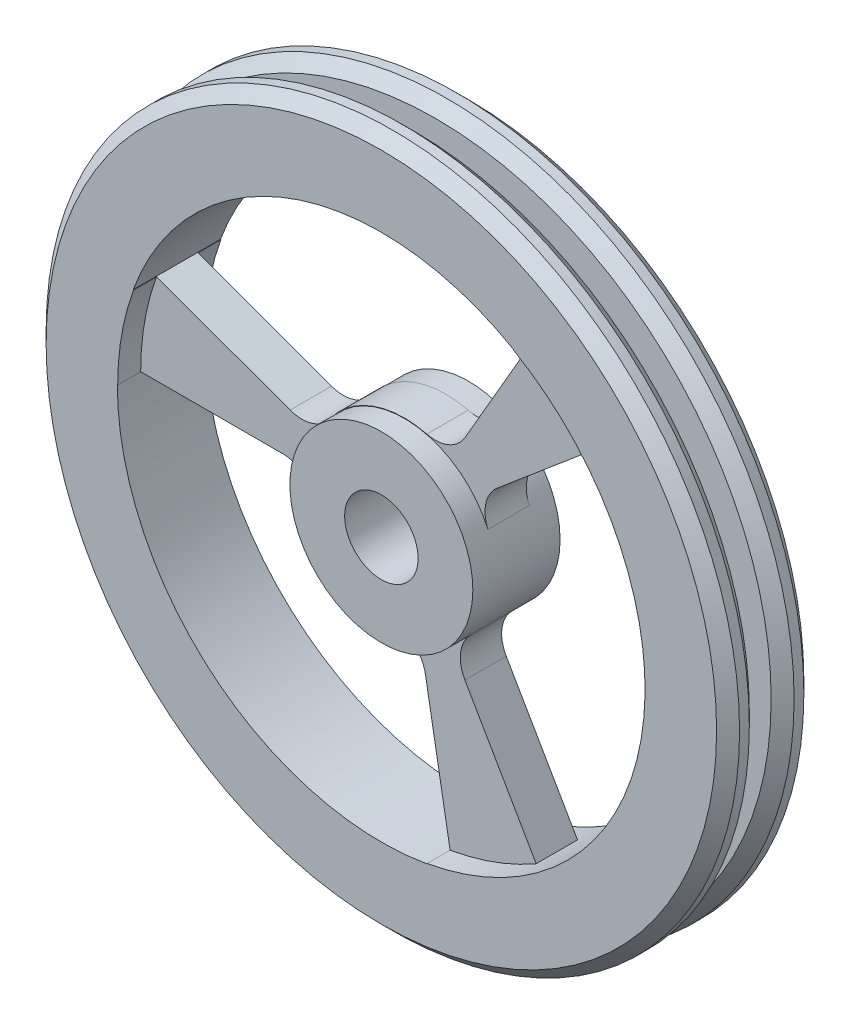
ISO-10303-21;
HEADER;
FILE_DESCRIPTION(('STEP AP214'),'2;1');
FILE_NAME('part.step','',(''),(''),'','','');
FILE_SCHEMA(('AUTOMOTIVE_DESIGN { 1 0 10303 214 1 1 1 1 }'));
ENDSEC;
DATA;
#1=APPLICATION_CONTEXT('core data for automotive mechanical design processes');
#2=APPLICATION_PROTOCOL_DEFINITION('international standard','automotive_design',2000,#1);
#3=PRODUCT_CONTEXT('',#1,'mechanical');
#4=PRODUCT('Part','Part','',(#3));
#5=PRODUCT_RELATED_PRODUCT_CATEGORY('part','',(#4));
#6=PRODUCT_DEFINITION_FORMATION('','',#4);
#7=PRODUCT_DEFINITION_CONTEXT('part definition',#1,'design');
#8=PRODUCT_DEFINITION('design','',#6,#7);
#9=PRODUCT_DEFINITION_SHAPE('','',#8);
#10=(LENGTH_UNIT() NAMED_UNIT(*) SI_UNIT(.MILLI.,.METRE.));
#11=(NAMED_UNIT(*) PLANE_ANGLE_UNIT() SI_UNIT($,.RADIAN.));
#12=(NAMED_UNIT(*) SI_UNIT($,.STERADIAN.) SOLID_ANGLE_UNIT());
#13=UNCERTAINTY_MEASURE_WITH_UNIT(LENGTH_MEASURE(1.E-05),#10,'distance_accuracy_value','');
#14=(GEOMETRIC_REPRESENTATION_CONTEXT(3) GLOBAL_UNCERTAINTY_ASSIGNED_CONTEXT((#13)) GLOBAL_UNIT_ASSIGNED_CONTEXT((#10,
#11,#12)) REPRESENTATION_CONTEXT('',''));
#15=CARTESIAN_POINT('',(0.,0.,0.));
#16=DIRECTION('',(0.,0.,1.));
#17=DIRECTION('',(1.,0.,0.));
#18=AXIS2_PLACEMENT_3D('',#15,#16,#17);
#19=CARTESIAN_POINT('',(0.,0.,19.304));
#20=DIRECTION('',(0.,0.,-1.));
#21=DIRECTION('',(-1.,0.,0.));
#22=AXIS2_PLACEMENT_3D('',#19,#20,#21);
#23=CYLINDRICAL_SURFACE('',#22,20.32);
#24=CARTESIAN_POINT('',(0.,0.,14.224));
#25=DIRECTION('',(0.,0.,1.));
#26=DIRECTION('',(1.,0.,0.));
#27=AXIS2_PLACEMENT_3D('',#24,#25,#26);
#28=CIRCLE('',#27,20.32);
#29=CARTESIAN_POINT('',(-19.5496969603027,-5.54181818181818,14.224));
#30=VERTEX_POINT('',#29);
#31=CARTESIAN_POINT('',(-2.06285626014119,-20.2150197637795,14.224));
#32=VERTEX_POINT('',#31);
#33=EDGE_CURVE('E561',#30,#32,#28,.T.);
#34=ORIENTED_EDGE('',*,*,#33,.F.);
#35=DIRECTION('',(0.,0.,-1.));
#36=VECTOR('',#35,1.);
#37=CARTESIAN_POINT('',(-19.5496969603027,-5.54181818181818,19.304));
#38=LINE('',#37,#36);
#39=CARTESIAN_POINT('',(-19.5496969603027,-5.54181818181818,5.08));
#40=VERTEX_POINT('',#39);
#41=EDGE_CURVE('E370',#30,#40,#38,.T.);
#42=ORIENTED_EDGE('',*,*,#41,.T.);
#43=CARTESIAN_POINT('',(0.,0.,5.08));
#44=DIRECTION('',(0.,0.,-1.));
#45=DIRECTION('',(-1.,0.,0.));
#46=AXIS2_PLACEMENT_3D('',#43,#44,#45);
#47=CIRCLE('',#46,20.32);
#48=CARTESIAN_POINT('',(-2.06285626014119,-20.2150197637795,5.08));
#49=VERTEX_POINT('',#48);
#50=EDGE_CURVE('E469',#49,#40,#47,.T.);
#51=ORIENTED_EDGE('',*,*,#50,.F.);
#52=DIRECTION('',(0.,0.,-1.));
#53=VECTOR('',#52,1.);
#54=CARTESIAN_POINT('',(-2.06285626014119,-20.2150197637795,19.304));
#55=LINE('',#54,#53);
#56=EDGE_CURVE('E364',#49,#32,#55,.F.);
#57=ORIENTED_EDGE('',*,*,#56,.T.);
#58=EDGE_LOOP('',(#34,#42,#51,#57));
#59=FACE_BOUND('',#58,.T.);
#60=ADVANCED_FACE('F50',(#59),#23,.T.);
#61=CARTESIAN_POINT('',(15.5725914999473,12.9212893123702,19.304));
#62=DIRECTION('',(-0.645028410307305,0.764158589493327,0.));
#63=DIRECTION('',(-0.764158589493327,-0.645028410307305,0.));
#64=AXIS2_PLACEMENT_3D('',#61,#62,#63);
#65=PLANE('',#64);
#66=DIRECTION('',(0.764158589493327,0.645028410307305,0.));
#67=VECTOR('',#66,1.);
#68=CARTESIAN_POINT('',(15.5725914999473,12.9212893123702,14.224));
#69=LINE('',#68,#67);
#70=CARTESIAN_POINT('',(20.5465180910194,17.1197947092038,14.224));
#71=VERTEX_POINT('',#70);
#72=CARTESIAN_POINT('',(44.6873937399769,37.4971756054888,14.224));
#73=VERTEX_POINT('',#72);
#74=EDGE_CURVE('E575',#71,#73,#69,.T.);
#75=ORIENTED_EDGE('',*,*,#74,.F.);
#76=DIRECTION('',(0.,0.,1.));
#77=VECTOR('',#76,1.);
#78=CARTESIAN_POINT('',(20.5465180910194,17.1197947092038,5.08));
#79=LINE('',#78,#77);
#80=CARTESIAN_POINT('',(20.5465180910194,17.1197947092038,5.08));
#81=VERTEX_POINT('',#80);
#82=EDGE_CURVE('E389',#71,#81,#79,.F.);
#83=ORIENTED_EDGE('',*,*,#82,.T.);
#84=DIRECTION('',(-0.764158589493327,-0.645028410307305,0.));
#85=VECTOR('',#84,1.);
#86=CARTESIAN_POINT('',(15.5725914999473,12.9212893123702,5.08));
#87=LINE('',#86,#85);
#88=CARTESIAN_POINT('',(44.6873937399769,37.4971756054888,5.08));
#89=VERTEX_POINT('',#88);
#90=EDGE_CURVE('E431',#89,#81,#87,.T.);
#91=ORIENTED_EDGE('',*,*,#90,.F.);
#92=DIRECTION('',(0.,0.,-1.));
#93=VECTOR('',#92,1.);
#94=CARTESIAN_POINT('',(44.6873937399769,37.4971756054888,19.304));
#95=LINE('',#94,#93);
#96=EDGE_CURVE('E486',#73,#89,#95,.T.);
#97=ORIENTED_EDGE('',*,*,#96,.F.);
#98=EDGE_LOOP('',(#75,#83,#91,#97));
#99=FACE_BOUND('',#98,.T.);
#100=ADVANCED_FACE('F630',(#99),#65,.F.);
#101=CARTESIAN_POINT('',(29.167624764714,-50.5198080285885,19.304));
#102=DIRECTION('',(-0.866025403784437,-0.500000000000003,0.));
#103=DIRECTION('',(0.500000000000003,-0.866025403784437,0.));
#104=AXIS2_PLACEMENT_3D('',#101,#102,#103);
#105=PLANE('',#104);
#106=DIRECTION('',(0.500000000000003,-0.866025403784437,0.));
#107=VECTOR('',#106,1.);
#108=CARTESIAN_POINT('',(29.167624764714,-50.5198080285885,5.08));
#109=LINE('',#108,#107);
#110=CARTESIAN_POINT('',(13.3963663575864,-23.2031871681458,5.08));
#111=VERTEX_POINT('',#110);
#112=CARTESIAN_POINT('',(29.167624764714,-50.5198080285885,5.08));
#113=VERTEX_POINT('',#112);
#114=EDGE_CURVE('E461',#111,#113,#109,.T.);
#115=ORIENTED_EDGE('',*,*,#114,.F.);
#116=DIRECTION('',(0.,0.,1.));
#117=VECTOR('',#116,1.);
#118=CARTESIAN_POINT('',(13.3963663575864,-23.2031871681458,14.224));
#119=LINE('',#118,#117);
#120=CARTESIAN_POINT('',(13.3963663575864,-23.2031871681458,14.224));
#121=VERTEX_POINT('',#120);
#122=EDGE_CURVE('E388',#111,#121,#119,.T.);
#123=ORIENTED_EDGE('',*,*,#122,.T.);
#124=DIRECTION('',(-0.500000000000003,0.866025403784437,0.));
#125=VECTOR('',#124,1.);
#126=CARTESIAN_POINT('',(29.167624764714,-50.5198080285885,14.224));
#127=LINE('',#126,#125);
#128=CARTESIAN_POINT('',(29.167624764714,-50.5198080285885,14.224));
#129=VERTEX_POINT('',#128);
#130=EDGE_CURVE('E568',#129,#121,#127,.T.);
#131=ORIENTED_EDGE('',*,*,#130,.F.);
#132=DIRECTION('',(0.,0.,-1.));
#133=VECTOR('',#132,1.);
#134=CARTESIAN_POINT('',(29.167624764714,-50.5198080285885,19.304));
#135=LINE('',#134,#133);
#136=EDGE_CURVE('E490',#129,#113,#135,.T.);
#137=ORIENTED_EDGE('',*,*,#136,.T.);
#138=EDGE_LOOP('',(#115,#123,#131,#137));
#139=FACE_BOUND('',#138,.T.);
#140=ADVANCED_FACE('F627',(#139),#105,.F.);
#141=CARTESIAN_POINT('',(0.,0.,19.304));
#142=DIRECTION('',(0.,0.,-1.));
#143=DIRECTION('',(-1.,0.,0.));
#144=AXIS2_PLACEMENT_3D('',#141,#142,#143);
#145=CYLINDRICAL_SURFACE('',#144,20.32);
#146=CARTESIAN_POINT('',(0.,0.,14.224));
#147=DIRECTION('',(0.,0.,1.));
#148=DIRECTION('',(1.,0.,0.));
#149=AXIS2_PLACEMENT_3D('',#146,#147,#148);
#150=CIRCLE('',#149,20.32);
#151=CARTESIAN_POINT('',(4.97549315154242,19.7014432948186,14.224));
#152=VERTEX_POINT('',#151);
#153=CARTESIAN_POINT('',(-16.4752925233669,11.8939958075278,14.224));
#154=VERTEX_POINT('',#153);
#155=EDGE_CURVE('E536',#152,#154,#150,.T.);
#156=ORIENTED_EDGE('',*,*,#155,.F.);
#157=DIRECTION('',(0.,0.,-1.));
#158=VECTOR('',#157,1.);
#159=CARTESIAN_POINT('',(4.97549315154242,19.7014432948186,19.304));
#160=LINE('',#159,#158);
#161=CARTESIAN_POINT('',(4.97549315154242,19.7014432948186,5.08));
#162=VERTEX_POINT('',#161);
#163=EDGE_CURVE('E355',#152,#162,#160,.T.);
#164=ORIENTED_EDGE('',*,*,#163,.T.);
#165=CARTESIAN_POINT('',(0.,0.,5.08));
#166=DIRECTION('',(0.,0.,-1.));
#167=DIRECTION('',(-1.,0.,0.));
#168=AXIS2_PLACEMENT_3D('',#165,#166,#167);
#169=CIRCLE('',#168,20.32);
#170=CARTESIAN_POINT('',(-16.4752925233669,11.8939958075278,5.08));
#171=VERTEX_POINT('',#170);
#172=EDGE_CURVE('E453',#171,#162,#169,.T.);
#173=ORIENTED_EDGE('',*,*,#172,.F.);
#174=DIRECTION('',(0.,0.,-1.));
#175=VECTOR('',#174,1.);
#176=CARTESIAN_POINT('',(-16.4752925233669,11.8939958075278,19.304));
#177=LINE('',#176,#175);
#178=EDGE_CURVE('E250',#171,#154,#177,.F.);
#179=ORIENTED_EDGE('',*,*,#178,.T.);
#180=EDGE_LOOP('',(#156,#164,#173,#179));
#181=FACE_BOUND('',#180,.T.);
#182=ADVANCED_FACE('F544',(#181),#145,.T.);
#183=CARTESIAN_POINT('',(0.,8.128,19.304));
#184=DIRECTION('',(0.,0.,1.));
#185=DIRECTION('',(1.,0.,0.));
#186=AXIS2_PLACEMENT_3D('',#183,#184,#185);
#187=PLANE('',#186);
#188=CARTESIAN_POINT('',(0.,0.,19.304));
#189=DIRECTION('',(0.,0.,-1.));
#190=DIRECTION('',(-1.,0.,0.));
#191=AXIS2_PLACEMENT_3D('',#188,#189,#190);
#192=CIRCLE('',#191,8.128);
#193=CARTESIAN_POINT('',(-8.128,0.,19.304));
#194=VERTEX_POINT('',#193);
#195=EDGE_CURVE('E305',#194,#194,#192,.T.);
#196=ORIENTED_EDGE('',*,*,#195,.T.);
#197=EDGE_LOOP('',(#196));
#198=FACE_BOUND('',#197,.T.);
#199=CARTESIAN_POINT('',(0.,0.,19.304));
#200=DIRECTION('',(0.,0.,1.));
#201=DIRECTION('',(1.,0.,0.));
#202=AXIS2_PLACEMENT_3D('',#199,#200,#201);
#203=CIRCLE('',#202,20.2352495294277);
#204=CARTESIAN_POINT('',(20.2352495294277,0.,19.304));
#205=VERTEX_POINT('',#204);
#206=EDGE_CURVE('E232',#205,#205,#203,.T.);
#207=ORIENTED_EDGE('',*,*,#206,.T.);
#208=EDGE_LOOP('',(#207));
#209=FACE_BOUND('',#208,.T.);
#210=ADVANCED_FACE('F648',(#198,#209),#187,.T.);
#211=CARTESIAN_POINT('',(0.,76.708,0.));
#212=DIRECTION('',(0.,0.,-1.));
#213=DIRECTION('',(-1.,0.,0.));
#214=AXIS2_PLACEMENT_3D('',#211,#212,#213);
#215=PLANE('',#214);
#216=CARTESIAN_POINT('',(0.,0.,0.));
#217=DIRECTION('',(0.,0.,-1.));
#218=DIRECTION('',(-1.,0.,0.));
#219=AXIS2_PLACEMENT_3D('',#216,#217,#218);
#220=CIRCLE('',#219,8.128);
#221=CARTESIAN_POINT('',(-8.128,0.,0.));
#222=VERTEX_POINT('',#221);
#223=EDGE_CURVE('E306',#222,#222,#220,.T.);
#224=ORIENTED_EDGE('',*,*,#223,.F.);
#225=EDGE_LOOP('',(#224));
#226=FACE_BOUND('',#225,.T.);
#227=CARTESIAN_POINT('',(0.,0.,0.));
#228=DIRECTION('',(0.,0.,1.));
#229=DIRECTION('',(1.,0.,0.));
#230=AXIS2_PLACEMENT_3D('',#227,#228,#229);
#231=CIRCLE('',#230,20.2352495294277);
#232=CARTESIAN_POINT('',(20.2352495294277,0.,0.));
#233=VERTEX_POINT('',#232);
#234=EDGE_CURVE('E234',#233,#233,#231,.T.);
#235=ORIENTED_EDGE('',*,*,#234,.F.);
#236=EDGE_LOOP('',(#235));
#237=FACE_BOUND('',#236,.T.);
#238=ADVANCED_FACE('F684',(#226,#237),#215,.T.);
#239=CARTESIAN_POINT('',(0.,0.,0.));
#240=DIRECTION('',(0.,0.,-1.));
#241=DIRECTION('',(-1.,0.,0.));
#242=AXIS2_PLACEMENT_3D('',#239,#240,#241);
#243=CIRCLE('',#242,58.3352495294277);
#244=CARTESIAN_POINT('',(-58.3352495294277,0.,0.));
#245=VERTEX_POINT('',#244);
#246=CARTESIAN_POINT('',(-54.8172035145079,19.9518304049933,0.));
#247=VERTEX_POINT('',#246);
#248=EDGE_CURVE('E438',#245,#247,#243,.T.);
#249=ORIENTED_EDGE('',*,*,#248,.F.);
#250=DIRECTION('',(1.,0.,0.));
#251=VECTOR('',#250,1.);
#252=CARTESIAN_POINT('',(-58.42,0.,0.));
#253=LINE('',#252,#251);
#254=CARTESIAN_POINT('',(-58.42,0.,0.));
#255=VERTEX_POINT('',#254);
#256=EDGE_CURVE('E277',#255,#245,#253,.T.);
#257=ORIENTED_EDGE('',*,*,#256,.F.);
#258=CARTESIAN_POINT('',(0.,0.,0.));
#259=DIRECTION('',(0.,0.,-1.));
#260=DIRECTION('',(1.,0.,0.));
#261=AXIS2_PLACEMENT_3D('',#258,#259,#260);
#262=CIRCLE('',#261,58.42);
#263=CARTESIAN_POINT('',(10.1445265393023,-57.5324689309732,0.));
#264=VERTEX_POINT('',#263);
#265=EDGE_CURVE('E280',#264,#255,#262,.T.);
#266=ORIENTED_EDGE('',*,*,#265,.F.);
#267=DIRECTION('',(0.173648177666934,-0.984807753012207,0.));
#268=VECTOR('',#267,1.);
#269=CARTESIAN_POINT('',(10.1445265393023,-57.5324689309732,0.));
#270=LINE('',#269,#268);
#271=CARTESIAN_POINT('',(10.129809774531,-57.4490060104821,0.));
#272=VERTEX_POINT('',#271);
#273=EDGE_CURVE('E267',#272,#264,#270,.T.);
#274=ORIENTED_EDGE('',*,*,#273,.F.);
#275=CARTESIAN_POINT('',(0.,0.,0.));
#276=DIRECTION('',(0.,0.,-1.));
#277=DIRECTION('',(-1.,0.,0.));
#278=AXIS2_PLACEMENT_3D('',#275,#276,#277);
#279=CIRCLE('',#278,58.3352495294277);
#280=CARTESIAN_POINT('',(29.1676247647141,50.5198080285885,0.));
#281=VERTEX_POINT('',#280);
#282=EDGE_CURVE('E498',#281,#272,#279,.T.);
#283=ORIENTED_EDGE('',*,*,#282,.F.);
#284=DIRECTION('',(-0.500000000000004,-0.866025403784436,0.));
#285=VECTOR('',#284,1.);
#286=CARTESIAN_POINT('',(29.2100000000002,50.5932040890868,0.));
#287=LINE('',#286,#285);
#288=CARTESIAN_POINT('',(29.2100000000002,50.5932040890868,0.));
#289=VERTEX_POINT('',#288);
#290=EDGE_CURVE('E515',#289,#281,#287,.T.);
#291=ORIENTED_EDGE('',*,*,#290,.F.);
#292=CARTESIAN_POINT('',(0.,0.,0.));
#293=DIRECTION('',(0.,0.,-1.));
#294=DIRECTION('',(-1.,0.,0.));
#295=AXIS2_PLACEMENT_3D('',#292,#293,#294);
#296=CIRCLE('',#295,58.42);
#297=CARTESIAN_POINT('',(-54.8968429063128,19.9808167730854,0.));
#298=VERTEX_POINT('',#297);
#299=EDGE_CURVE('E284',#298,#289,#296,.T.);
#300=ORIENTED_EDGE('',*,*,#299,.F.);
#301=DIRECTION('',(-0.93969262078591,0.342020143325666,0.));
#302=VECTOR('',#301,1.);
#303=CARTESIAN_POINT('',(-54.8968429063128,19.9808167730854,0.));
#304=LINE('',#303,#302);
#305=EDGE_CURVE('E256',#247,#298,#304,.T.);
#306=ORIENTED_EDGE('',*,*,#305,.F.);
#307=EDGE_LOOP('',(#249,#257,#266,#274,#283,#291,#300,#306));
#308=FACE_BOUND('',#307,.T.);
#309=CARTESIAN_POINT('',(0.,0.,0.));
#310=DIRECTION('',(0.,0.,-1.));
#311=DIRECTION('',(-1.,0.,0.));
#312=AXIS2_PLACEMENT_3D('',#309,#310,#311);
#313=CIRCLE('',#312,74.168);
#314=CARTESIAN_POINT('',(-74.168,0.,0.));
#315=VERTEX_POINT('',#314);
#316=EDGE_CURVE('E309',#315,#315,#313,.T.);
#317=ORIENTED_EDGE('',*,*,#316,.T.);
#318=EDGE_LOOP('',(#317));
#319=FACE_BOUND('',#318,.T.);
#320=ADVANCED_FACE('F523',(#308,#319),#215,.T.);
#321=CARTESIAN_POINT('',(0.,0.,0.));
#322=DIRECTION('',(0.,0.,-1.));
#323=DIRECTION('',(-1.,0.,0.));
#324=AXIS2_PLACEMENT_3D('',#321,#322,#323);
#325=CYLINDRICAL_SURFACE('',#324,8.128);
#326=ORIENTED_EDGE('',*,*,#223,.T.);
#327=EDGE_LOOP('',(#326));
#328=FACE_BOUND('',#327,.T.);
#329=ORIENTED_EDGE('',*,*,#195,.F.);
#330=EDGE_LOOP('',(#329));
#331=FACE_BOUND('',#330,.T.);
#332=ADVANCED_FACE('F676',(#328,#331),#325,.F.);
#333=DIRECTION('',(-0.500000000000004,-0.866025403784436,0.));
#334=VECTOR('',#333,1.);
#335=CARTESIAN_POINT('',(29.2100000000002,50.5932040890868,19.304));
#336=LINE('',#335,#334);
#337=CARTESIAN_POINT('',(29.2100000000002,50.5932040890868,19.304));
#338=VERTEX_POINT('',#337);
#339=CARTESIAN_POINT('',(29.1676247647141,50.5198080285884,19.304));
#340=VERTEX_POINT('',#339);
#341=EDGE_CURVE('E245',#338,#340,#336,.T.);
#342=ORIENTED_EDGE('',*,*,#341,.T.);
#343=CARTESIAN_POINT('',(0.,0.,19.304));
#344=DIRECTION('',(0.,0.,-1.));
#345=DIRECTION('',(-1.,0.,0.));
#346=AXIS2_PLACEMENT_3D('',#343,#344,#345);
#347=CIRCLE('',#346,58.3352495294277);
#348=CARTESIAN_POINT('',(10.129809774531,-57.4490060104821,19.304));
#349=VERTEX_POINT('',#348);
#350=EDGE_CURVE('E217',#340,#349,#347,.T.);
#351=ORIENTED_EDGE('',*,*,#350,.T.);
#352=DIRECTION('',(0.173648177666934,-0.984807753012207,0.));
#353=VECTOR('',#352,1.);
#354=CARTESIAN_POINT('',(10.1445265393023,-57.5324689309732,19.304));
#355=LINE('',#354,#353);
#356=CARTESIAN_POINT('',(10.1445265393023,-57.5324689309732,19.304));
#357=VERTEX_POINT('',#356);
#358=EDGE_CURVE('E271',#349,#357,#355,.T.);
#359=ORIENTED_EDGE('',*,*,#358,.T.);
#360=CARTESIAN_POINT('',(0.,0.,19.304));
#361=DIRECTION('',(0.,0.,-1.));
#362=DIRECTION('',(1.,0.,0.));
#363=AXIS2_PLACEMENT_3D('',#360,#361,#362);
#364=CIRCLE('',#363,58.42);
#365=CARTESIAN_POINT('',(-58.42,0.,19.304));
#366=VERTEX_POINT('',#365);
#367=EDGE_CURVE('E263',#357,#366,#364,.T.);
#368=ORIENTED_EDGE('',*,*,#367,.T.);
#369=DIRECTION('',(1.,0.,0.));
#370=VECTOR('',#369,1.);
#371=CARTESIAN_POINT('',(-58.42,0.,19.304));
#372=LINE('',#371,#370);
#373=CARTESIAN_POINT('',(-58.3352495294277,0.,19.304));
#374=VERTEX_POINT('',#373);
#375=EDGE_CURVE('E268',#366,#374,#372,.T.);
#376=ORIENTED_EDGE('',*,*,#375,.T.);
#377=CARTESIAN_POINT('',(0.,0.,19.304));
#378=DIRECTION('',(0.,0.,1.));
#379=DIRECTION('',(1.,0.,0.));
#380=AXIS2_PLACEMENT_3D('',#377,#378,#379);
#381=CIRCLE('',#380,58.3352495294277);
#382=CARTESIAN_POINT('',(-54.8172035145079,19.9518304049933,19.304));
#383=VERTEX_POINT('',#382);
#384=EDGE_CURVE('E558',#383,#374,#381,.T.);
#385=ORIENTED_EDGE('',*,*,#384,.F.);
#386=DIRECTION('',(-0.93969262078591,0.342020143325666,0.));
#387=VECTOR('',#386,1.);
#388=CARTESIAN_POINT('',(-54.8968429063128,19.9808167730854,19.304));
#389=LINE('',#388,#387);
#390=CARTESIAN_POINT('',(-54.8968429063128,19.9808167730854,19.304));
#391=VERTEX_POINT('',#390);
#392=EDGE_CURVE('E251',#383,#391,#389,.T.);
#393=ORIENTED_EDGE('',*,*,#392,.T.);
#394=CARTESIAN_POINT('',(0.,0.,19.304));
#395=DIRECTION('',(0.,0.,-1.));
#396=DIRECTION('',(-1.,0.,0.));
#397=AXIS2_PLACEMENT_3D('',#394,#395,#396);
#398=CIRCLE('',#397,58.42);
#399=EDGE_CURVE('E255',#391,#338,#398,.T.);
#400=ORIENTED_EDGE('',*,*,#399,.T.);
#401=EDGE_LOOP('',(#342,#351,#359,#368,#376,#385,#393,#400));
#402=FACE_BOUND('',#401,.T.);
#403=CARTESIAN_POINT('',(0.,0.,19.304));
#404=DIRECTION('',(0.,0.,1.));
#405=DIRECTION('',(1.,0.,0.));
#406=AXIS2_PLACEMENT_3D('',#403,#404,#405);
#407=CIRCLE('',#406,74.168);
#408=CARTESIAN_POINT('',(74.168,0.,19.304));
#409=VERTEX_POINT('',#408);
#410=EDGE_CURVE('E332',#409,#409,#407,.T.);
#411=ORIENTED_EDGE('',*,*,#410,.T.);
#412=EDGE_LOOP('',(#411));
#413=FACE_BOUND('',#412,.T.);
#414=ADVANCED_FACE('F248',(#402,#413),#187,.T.);
#415=CARTESIAN_POINT('',(0.,0.,0.));
#416=DIRECTION('',(0.,0.,-1.));
#417=DIRECTION('',(-1.,0.,0.));
#418=AXIS2_PLACEMENT_3D('',#415,#416,#417);
#419=CYLINDRICAL_SURFACE('',#418,76.708);
#420=CARTESIAN_POINT('',(0.,0.,16.764));
#421=DIRECTION('',(0.,0.,1.));
#422=DIRECTION('',(1.,0.,0.));
#423=AXIS2_PLACEMENT_3D('',#420,#421,#422);
#424=CIRCLE('',#423,76.708);
#425=CARTESIAN_POINT('',(76.708,0.,16.764));
#426=VERTEX_POINT('',#425);
#427=EDGE_CURVE('E329',#426,#426,#424,.F.);
#428=ORIENTED_EDGE('',*,*,#427,.T.);
#429=EDGE_LOOP('',(#428));
#430=FACE_BOUND('',#429,.T.);
#431=CARTESIAN_POINT('',(0.,0.,14.605));
#432=DIRECTION('',(0.,0.,-1.));
#433=DIRECTION('',(-1.,0.,0.));
#434=AXIS2_PLACEMENT_3D('',#431,#432,#433);
#435=CIRCLE('',#434,76.708);
#436=CARTESIAN_POINT('',(-76.708,0.,14.605));
#437=VERTEX_POINT('',#436);
#438=EDGE_CURVE('E326',#437,#437,#435,.F.);
#439=ORIENTED_EDGE('',*,*,#438,.T.);
#440=EDGE_LOOP('',(#439));
#441=FACE_BOUND('',#440,.T.);
#442=ADVANCED_FACE('F671',(#430,#441),#419,.T.);
#443=CARTESIAN_POINT('',(0.,76.708,12.065));
#444=DIRECTION('',(0.,0.,-1.));
#445=DIRECTION('',(-1.,0.,0.));
#446=AXIS2_PLACEMENT_3D('',#443,#444,#445);
#447=PLANE('',#446);
#448=CARTESIAN_POINT('',(0.,0.,12.065));
#449=DIRECTION('',(0.,0.,-1.));
#450=DIRECTION('',(-1.,0.,0.));
#451=AXIS2_PLACEMENT_3D('',#448,#449,#450);
#452=CIRCLE('',#451,74.1679999999999);
#453=CARTESIAN_POINT('',(-74.1679999999999,0.,12.065));
#454=VERTEX_POINT('',#453);
#455=EDGE_CURVE('E336',#454,#454,#452,.T.);
#456=ORIENTED_EDGE('',*,*,#455,.T.);
#457=EDGE_LOOP('',(#456));
#458=FACE_BOUND('',#457,.T.);
#459=CARTESIAN_POINT('',(0.,0.,12.065));
#460=DIRECTION('',(0.,0.,-1.));
#461=DIRECTION('',(-1.,0.,0.));
#462=AXIS2_PLACEMENT_3D('',#459,#460,#461);
#463=CIRCLE('',#462,64.008);
#464=CARTESIAN_POINT('',(-64.008,0.,12.065));
#465=VERTEX_POINT('',#464);
#466=EDGE_CURVE('E296',#465,#465,#463,.T.);
#467=ORIENTED_EDGE('',*,*,#466,.F.);
#468=EDGE_LOOP('',(#467));
#469=FACE_BOUND('',#468,.T.);
#470=ADVANCED_FACE('F666',(#458,#469),#447,.T.);
#471=CARTESIAN_POINT('',(0.,0.,0.));
#472=DIRECTION('',(0.,0.,-1.));
#473=DIRECTION('',(-1.,0.,0.));
#474=AXIS2_PLACEMENT_3D('',#471,#472,#473);
#475=CYLINDRICAL_SURFACE('',#474,64.008);
#476=ORIENTED_EDGE('',*,*,#466,.T.);
#477=EDGE_LOOP('',(#476));
#478=FACE_BOUND('',#477,.T.);
#479=CARTESIAN_POINT('',(0.,0.,7.239));
#480=DIRECTION('',(0.,0.,-1.));
#481=DIRECTION('',(-1.,0.,0.));
#482=AXIS2_PLACEMENT_3D('',#479,#480,#481);
#483=CIRCLE('',#482,64.008);
#484=CARTESIAN_POINT('',(-64.008,0.,7.239));
#485=VERTEX_POINT('',#484);
#486=EDGE_CURVE('E293',#485,#485,#483,.T.);
#487=ORIENTED_EDGE('',*,*,#486,.F.);
#488=EDGE_LOOP('',(#487));
#489=FACE_BOUND('',#488,.T.);
#490=ADVANCED_FACE('F664',(#478,#489),#475,.T.);
#491=CARTESIAN_POINT('',(0.,64.008,7.239));
#492=DIRECTION('',(0.,0.,1.));
#493=DIRECTION('',(1.,0.,0.));
#494=AXIS2_PLACEMENT_3D('',#491,#492,#493);
#495=PLANE('',#494);
#496=CARTESIAN_POINT('',(0.,0.,7.239));
#497=DIRECTION('',(0.,0.,1.));
#498=DIRECTION('',(1.,0.,0.));
#499=AXIS2_PLACEMENT_3D('',#496,#497,#498);
#500=CIRCLE('',#499,74.168);
#501=CARTESIAN_POINT('',(74.168,0.,7.239));
#502=VERTEX_POINT('',#501);
#503=EDGE_CURVE('E325',#502,#502,#500,.T.);
#504=ORIENTED_EDGE('',*,*,#503,.T.);
#505=EDGE_LOOP('',(#504));
#506=FACE_BOUND('',#505,.T.);
#507=ORIENTED_EDGE('',*,*,#486,.T.);
#508=EDGE_LOOP('',(#507));
#509=FACE_BOUND('',#508,.T.);
#510=ADVANCED_FACE('F659',(#506,#509),#495,.T.);
#511=CARTESIAN_POINT('',(0.,0.,0.));
#512=DIRECTION('',(0.,0.,-1.));
#513=DIRECTION('',(-1.,0.,0.));
#514=AXIS2_PLACEMENT_3D('',#511,#512,#513);
#515=CYLINDRICAL_SURFACE('',#514,76.708);
#516=CARTESIAN_POINT('',(0.,0.,2.54000000000004));
#517=DIRECTION('',(0.,0.,-1.));
#518=DIRECTION('',(-1.,0.,0.));
#519=AXIS2_PLACEMENT_3D('',#516,#517,#518);
#520=CIRCLE('',#519,76.708);
#521=CARTESIAN_POINT('',(-76.708,0.,2.54000000000004));
#522=VERTEX_POINT('',#521);
#523=EDGE_CURVE('E319',#522,#522,#520,.F.);
#524=ORIENTED_EDGE('',*,*,#523,.T.);
#525=EDGE_LOOP('',(#524));
#526=FACE_BOUND('',#525,.T.);
#527=CARTESIAN_POINT('',(0.,0.,4.69900000000003));
#528=DIRECTION('',(0.,0.,1.));
#529=DIRECTION('',(1.,0.,0.));
#530=AXIS2_PLACEMENT_3D('',#527,#528,#529);
#531=CIRCLE('',#530,76.708);
#532=CARTESIAN_POINT('',(76.708,0.,4.69900000000003));
#533=VERTEX_POINT('',#532);
#534=EDGE_CURVE('E313',#533,#533,#531,.F.);
#535=ORIENTED_EDGE('',*,*,#534,.T.);
#536=EDGE_LOOP('',(#535));
#537=FACE_BOUND('',#536,.T.);
#538=ADVANCED_FACE('F656',(#526,#537),#515,.T.);
#539=CARTESIAN_POINT('',(0.,0.,0.));
#540=DIRECTION('',(0.,0.,1.));
#541=DIRECTION('',(1.,0.,0.));
#542=AXIS2_PLACEMENT_3D('',#539,#540,#541);
#543=CONICAL_SURFACE('',#542,74.168,0.785398163397443);
#544=ORIENTED_EDGE('',*,*,#523,.F.);
#545=EDGE_LOOP('',(#544));
#546=FACE_BOUND('',#545,.T.);
#547=ORIENTED_EDGE('',*,*,#316,.F.);
#548=EDGE_LOOP('',(#547));
#549=FACE_BOUND('',#548,.T.);
#550=ADVANCED_FACE('F657',(#546,#549),#543,.T.);
#551=CARTESIAN_POINT('',(0.,0.,4.69900000000003));
#552=DIRECTION('',(0.,0.,-1.));
#553=DIRECTION('',(-1.,0.,0.));
#554=AXIS2_PLACEMENT_3D('',#551,#552,#553);
#555=CONICAL_SURFACE('',#554,76.708,0.785398163397454);
#556=ORIENTED_EDGE('',*,*,#503,.F.);
#557=EDGE_LOOP('',(#556));
#558=FACE_BOUND('',#557,.T.);
#559=ORIENTED_EDGE('',*,*,#534,.F.);
#560=EDGE_LOOP('',(#559));
#561=FACE_BOUND('',#560,.T.);
#562=ADVANCED_FACE('F695',(#558,#561),#555,.T.);
#563=CARTESIAN_POINT('',(0.,0.,16.764));
#564=DIRECTION('',(0.,0.,-1.));
#565=DIRECTION('',(-1.,0.,0.));
#566=AXIS2_PLACEMENT_3D('',#563,#564,#565);
#567=CONICAL_SURFACE('',#566,76.708,0.785398163397448);
#568=ORIENTED_EDGE('',*,*,#410,.F.);
#569=EDGE_LOOP('',(#568));
#570=FACE_BOUND('',#569,.T.);
#571=ORIENTED_EDGE('',*,*,#427,.F.);
#572=EDGE_LOOP('',(#571));
#573=FACE_BOUND('',#572,.T.);
#574=ADVANCED_FACE('F697',(#570,#573),#567,.T.);
#575=CARTESIAN_POINT('',(0.,0.,12.065));
#576=DIRECTION('',(0.,0.,1.));
#577=DIRECTION('',(1.,0.,0.));
#578=AXIS2_PLACEMENT_3D('',#575,#576,#577);
#579=CONICAL_SURFACE('',#578,74.1679999999999,0.785398163397451);
#580=ORIENTED_EDGE('',*,*,#438,.F.);
#581=EDGE_LOOP('',(#580));
#582=FACE_BOUND('',#581,.T.);
#583=ORIENTED_EDGE('',*,*,#455,.F.);
#584=EDGE_LOOP('',(#583));
#585=FACE_BOUND('',#584,.T.);
#586=ADVANCED_FACE('F654',(#582,#585),#579,.T.);
#587=CARTESIAN_POINT('',(0.,0.,19.304));
#588=DIRECTION('',(0.,0.,-1.));
#589=DIRECTION('',(-1.,0.,0.));
#590=AXIS2_PLACEMENT_3D('',#587,#588,#589);
#591=CYLINDRICAL_SURFACE('',#590,58.42);
#592=ORIENTED_EDGE('',*,*,#265,.T.);
#593=DIRECTION('',(0.,0.,-1.));
#594=VECTOR('',#593,1.);
#595=CARTESIAN_POINT('',(-58.42,0.,19.304));
#596=LINE('',#595,#594);
#597=EDGE_CURVE('E278',#366,#255,#596,.T.);
#598=ORIENTED_EDGE('',*,*,#597,.F.);
#599=ORIENTED_EDGE('',*,*,#367,.F.);
#600=DIRECTION('',(0.,0.,-1.));
#601=VECTOR('',#600,1.);
#602=CARTESIAN_POINT('',(10.1445265393023,-57.5324689309732,19.304));
#603=LINE('',#602,#601);
#604=EDGE_CURVE('E289',#357,#264,#603,.T.);
#605=ORIENTED_EDGE('',*,*,#604,.T.);
#606=EDGE_LOOP('',(#592,#598,#599,#605));
#607=FACE_BOUND('',#606,.T.);
#608=ADVANCED_FACE('F593',(#607),#591,.F.);
#609=CARTESIAN_POINT('',(10.1445265393023,-57.5324689309732,19.304));
#610=DIRECTION('',(0.984807753012207,0.173648177666934,0.));
#611=DIRECTION('',(-0.173648177666934,0.984807753012208,0.));
#612=AXIS2_PLACEMENT_3D('',#609,#610,#611);
#613=PLANE('',#612);
#614=DIRECTION('',(0.173648177666934,-0.984807753012208,0.));
#615=VECTOR('',#614,1.);
#616=CARTESIAN_POINT('',(10.1445265393023,-57.5324689309732,14.224));
#617=LINE('',#616,#615);
#618=CARTESIAN_POINT('',(4.66780772025888,-26.4724530613748,14.224));
#619=VERTEX_POINT('',#618);
#620=CARTESIAN_POINT('',(10.129809774531,-57.4490060104821,14.224));
#621=VERTEX_POINT('',#620);
#622=EDGE_CURVE('E564',#619,#621,#617,.T.);
#623=ORIENTED_EDGE('',*,*,#622,.F.);
#624=DIRECTION('',(0.,0.,1.));
#625=VECTOR('',#624,1.);
#626=CARTESIAN_POINT('',(4.66780772025888,-26.4724530613748,5.08));
#627=LINE('',#626,#625);
#628=CARTESIAN_POINT('',(4.66780772025888,-26.4724530613748,5.08));
#629=VERTEX_POINT('',#628);
#630=EDGE_CURVE('E372',#619,#629,#627,.F.);
#631=ORIENTED_EDGE('',*,*,#630,.T.);
#632=DIRECTION('',(-0.173648177666934,0.984807753012208,0.));
#633=VECTOR('',#632,1.);
#634=CARTESIAN_POINT('',(10.1445265393023,-57.5324689309732,5.08));
#635=LINE('',#634,#633);
#636=CARTESIAN_POINT('',(10.129809774531,-57.4490060104821,5.08));
#637=VERTEX_POINT('',#636);
#638=EDGE_CURVE('E471',#637,#629,#635,.T.);
#639=ORIENTED_EDGE('',*,*,#638,.F.);
#640=DIRECTION('',(0.,0.,-1.));
#641=VECTOR('',#640,1.);
#642=CARTESIAN_POINT('',(10.129809774531,-57.4490060104821,5.08));
#643=LINE('',#642,#641);
#644=EDGE_CURVE('E481',#637,#272,#643,.T.);
#645=ORIENTED_EDGE('',*,*,#644,.T.);
#646=ORIENTED_EDGE('',*,*,#273,.T.);
#647=ORIENTED_EDGE('',*,*,#604,.F.);
#648=ORIENTED_EDGE('',*,*,#358,.F.);
#649=DIRECTION('',(0.,0.,1.));
#650=VECTOR('',#649,1.);
#651=CARTESIAN_POINT('',(10.129809774531,-57.4490060104821,14.224));
#652=LINE('',#651,#650);
#653=EDGE_CURVE('E230',#349,#621,#652,.F.);
#654=ORIENTED_EDGE('',*,*,#653,.T.);
#655=EDGE_LOOP('',(#623,#631,#639,#645,#646,#647,#648,#654));
#656=FACE_BOUND('',#655,.T.);
#657=ADVANCED_FACE('F616',(#656),#613,.F.);
#658=CARTESIAN_POINT('',(-58.42,0.,19.304));
#659=DIRECTION('',(0.,1.,0.));
#660=DIRECTION('',(0.,0.,1.));
#661=AXIS2_PLACEMENT_3D('',#658,#659,#660);
#662=PLANE('',#661);
#663=DIRECTION('',(-1.,0.,0.));
#664=VECTOR('',#663,1.);
#665=CARTESIAN_POINT('',(-58.42,0.,5.08));
#666=LINE('',#665,#664);
#667=CARTESIAN_POINT('',(-26.8808333204162,0.,5.08));
#668=VERTEX_POINT('',#667);
#669=CARTESIAN_POINT('',(-58.3352495294277,0.,5.08));
#670=VERTEX_POINT('',#669);
#671=EDGE_CURVE('E467',#668,#670,#666,.T.);
#672=ORIENTED_EDGE('',*,*,#671,.F.);
#673=DIRECTION('',(0.,0.,1.));
#674=VECTOR('',#673,1.);
#675=CARTESIAN_POINT('',(-26.8808333204162,0.,14.224));
#676=LINE('',#675,#674);
#677=CARTESIAN_POINT('',(-26.8808333204162,0.,14.224));
#678=VERTEX_POINT('',#677);
#679=EDGE_CURVE('E371',#668,#678,#676,.T.);
#680=ORIENTED_EDGE('',*,*,#679,.T.);
#681=DIRECTION('',(1.,0.,0.));
#682=VECTOR('',#681,1.);
#683=CARTESIAN_POINT('',(-58.42,0.,14.224));
#684=LINE('',#683,#682);
#685=CARTESIAN_POINT('',(-58.3352495294277,0.,14.224));
#686=VERTEX_POINT('',#685);
#687=EDGE_CURVE('E548',#686,#678,#684,.T.);
#688=ORIENTED_EDGE('',*,*,#687,.F.);
#689=DIRECTION('',(0.,0.,1.));
#690=VECTOR('',#689,1.);
#691=CARTESIAN_POINT('',(-58.3352495294277,0.,14.224));
#692=LINE('',#691,#690);
#693=EDGE_CURVE('E443',#686,#374,#692,.T.);
#694=ORIENTED_EDGE('',*,*,#693,.T.);
#695=ORIENTED_EDGE('',*,*,#375,.F.);
#696=ORIENTED_EDGE('',*,*,#597,.T.);
#697=ORIENTED_EDGE('',*,*,#256,.T.);
#698=DIRECTION('',(0.,0.,-1.));
#699=VECTOR('',#698,1.);
#700=CARTESIAN_POINT('',(-58.3352495294277,0.,5.08));
#701=LINE('',#700,#699);
#702=EDGE_CURVE('E477',#245,#670,#701,.F.);
#703=ORIENTED_EDGE('',*,*,#702,.T.);
#704=EDGE_LOOP('',(#672,#680,#688,#694,#695,#696,#697,#703));
#705=FACE_BOUND('',#704,.T.);
#706=ADVANCED_FACE('F584',(#705),#662,.F.);
#707=CARTESIAN_POINT('',(0.,0.,19.304));
#708=DIRECTION('',(0.,0.,-1.));
#709=DIRECTION('',(-1.,0.,0.));
#710=AXIS2_PLACEMENT_3D('',#707,#708,#709);
#711=CYLINDRICAL_SURFACE('',#710,58.3352495294277);
#712=ORIENTED_EDGE('',*,*,#136,.F.);
#713=CARTESIAN_POINT('',(0.,0.,14.224));
#714=DIRECTION('',(0.,0.,1.));
#715=DIRECTION('',(1.,0.,0.));
#716=AXIS2_PLACEMENT_3D('',#713,#714,#715);
#717=CIRCLE('',#716,58.3352495294277);
#718=EDGE_CURVE('E555',#621,#129,#717,.T.);
#719=ORIENTED_EDGE('',*,*,#718,.F.);
#720=ORIENTED_EDGE('',*,*,#653,.F.);
#721=ORIENTED_EDGE('',*,*,#350,.F.);
#722=DIRECTION('',(0.,0.,1.));
#723=VECTOR('',#722,1.);
#724=CARTESIAN_POINT('',(29.1676247647141,50.5198080285884,14.224));
#725=LINE('',#724,#723);
#726=CARTESIAN_POINT('',(29.1676247647141,50.5198080285884,14.224));
#727=VERTEX_POINT('',#726);
#728=EDGE_CURVE('E223',#727,#340,#725,.T.);
#729=ORIENTED_EDGE('',*,*,#728,.F.);
#730=EDGE_CURVE('E547',#73,#727,#717,.T.);
#731=ORIENTED_EDGE('',*,*,#730,.F.);
#732=ORIENTED_EDGE('',*,*,#96,.T.);
#733=CARTESIAN_POINT('',(0.,0.,5.08));
#734=DIRECTION('',(0.,0.,-1.));
#735=DIRECTION('',(-1.,0.,0.));
#736=AXIS2_PLACEMENT_3D('',#733,#734,#735);
#737=CIRCLE('',#736,58.3352495294277);
#738=CARTESIAN_POINT('',(29.1676247647141,50.5198080285885,5.08));
#739=VERTEX_POINT('',#738);
#740=EDGE_CURVE('E455',#739,#89,#737,.T.);
#741=ORIENTED_EDGE('',*,*,#740,.F.);
#742=DIRECTION('',(0.,0.,-1.));
#743=VECTOR('',#742,1.);
#744=CARTESIAN_POINT('',(29.1676247647141,50.5198080285885,5.08));
#745=LINE('',#744,#743);
#746=EDGE_CURVE('E342',#281,#739,#745,.F.);
#747=ORIENTED_EDGE('',*,*,#746,.F.);
#748=ORIENTED_EDGE('',*,*,#282,.T.);
#749=ORIENTED_EDGE('',*,*,#644,.F.);
#750=EDGE_CURVE('E445',#113,#637,#737,.T.);
#751=ORIENTED_EDGE('',*,*,#750,.F.);
#752=EDGE_LOOP('',(#712,#719,#720,#721,#729,#731,#732,#741,#747,#748,#749,#751));
#753=FACE_BOUND('',#752,.T.);
#754=ADVANCED_FACE('F225',(#753),#711,.F.);
#755=CARTESIAN_POINT('',(0.,0.,19.304));
#756=DIRECTION('',(0.,0.,-1.));
#757=DIRECTION('',(-1.,0.,0.));
#758=AXIS2_PLACEMENT_3D('',#755,#756,#757);
#759=CYLINDRICAL_SURFACE('',#758,20.2352495294277);
#760=DIRECTION('',(0.,0.,-1.));
#761=VECTOR('',#760,1.);
#762=CARTESIAN_POINT('',(14.525575350035,-14.0880440185519,19.304));
#763=LINE('',#762,#761);
#764=CARTESIAN_POINT('',(14.525575350035,-14.0880440185519,14.224));
#765=VERTEX_POINT('',#764);
#766=CARTESIAN_POINT('',(14.525575350035,-14.0880440185519,5.08));
#767=VERTEX_POINT('',#766);
#768=EDGE_CURVE('E385',#765,#767,#763,.T.);
#769=ORIENTED_EDGE('',*,*,#768,.T.);
#770=CARTESIAN_POINT('',(0.,0.,5.08));
#771=DIRECTION('',(0.,0.,-1.));
#772=DIRECTION('',(-1.,0.,0.));
#773=AXIS2_PLACEMENT_3D('',#770,#771,#772);
#774=CIRCLE('',#773,20.2352495294277);
#775=CARTESIAN_POINT('',(18.4964248322294,8.2065578620936,5.08));
#776=VERTEX_POINT('',#775);
#777=EDGE_CURVE('E430',#767,#776,#774,.T.);
#778=ORIENTED_EDGE('',*,*,#777,.T.);
#779=DIRECTION('',(0.,0.,-1.));
#780=VECTOR('',#779,1.);
#781=CARTESIAN_POINT('',(18.4964248322294,8.2065578620936,19.304));
#782=LINE('',#781,#780);
#783=CARTESIAN_POINT('',(18.4964248322294,8.2065578620936,14.224));
#784=VERTEX_POINT('',#783);
#785=EDGE_CURVE('E377',#776,#784,#782,.F.);
#786=ORIENTED_EDGE('',*,*,#785,.T.);
#787=CARTESIAN_POINT('',(0.,0.,14.224));
#788=DIRECTION('',(0.,0.,1.));
#789=DIRECTION('',(1.,0.,0.));
#790=AXIS2_PLACEMENT_3D('',#787,#788,#789);
#791=CIRCLE('',#790,20.2352495294277);
#792=EDGE_CURVE('E434',#784,#765,#791,.T.);
#793=ORIENTED_EDGE('',*,*,#792,.T.);
#794=EDGE_LOOP('',(#769,#778,#786,#793));
#795=FACE_BOUND('',#794,.T.);
#796=ORIENTED_EDGE('',*,*,#206,.F.);
#797=EDGE_LOOP('',(#796));
#798=FACE_BOUND('',#797,.T.);
#799=ORIENTED_EDGE('',*,*,#234,.T.);
#800=EDGE_LOOP('',(#799));
#801=FACE_BOUND('',#800,.T.);
#802=ADVANCED_FACE('F433',(#795,#798,#801),#759,.T.);
#803=CARTESIAN_POINT('',(0.,0.,19.304));
#804=DIRECTION('',(0.,0.,-1.));
#805=DIRECTION('',(-1.,0.,0.));
#806=AXIS2_PLACEMENT_3D('',#803,#804,#805);
#807=CYLINDRICAL_SURFACE('',#806,58.42);
#808=ORIENTED_EDGE('',*,*,#299,.T.);
#809=DIRECTION('',(0.,0.,-1.));
#810=VECTOR('',#809,1.);
#811=CARTESIAN_POINT('',(29.2100000000002,50.5932040890868,19.304));
#812=LINE('',#811,#810);
#813=EDGE_CURVE('E257',#338,#289,#812,.T.);
#814=ORIENTED_EDGE('',*,*,#813,.F.);
#815=ORIENTED_EDGE('',*,*,#399,.F.);
#816=DIRECTION('',(0.,0.,-1.));
#817=VECTOR('',#816,1.);
#818=CARTESIAN_POINT('',(-54.8968429063128,19.9808167730854,19.304));
#819=LINE('',#818,#817);
#820=EDGE_CURVE('E501',#391,#298,#819,.T.);
#821=ORIENTED_EDGE('',*,*,#820,.T.);
#822=EDGE_LOOP('',(#808,#814,#815,#821));
#823=FACE_BOUND('',#822,.T.);
#824=ADVANCED_FACE('F516',(#823),#807,.F.);
#825=CARTESIAN_POINT('',(-54.8968429063128,19.9808167730854,19.304));
#826=DIRECTION('',(-0.342020143325666,-0.939692620785909,0.));
#827=DIRECTION('',(0.93969262078591,-0.342020143325666,0.));
#828=AXIS2_PLACEMENT_3D('',#825,#826,#827);
#829=PLANE('',#828);
#830=DIRECTION('',(-0.93969262078591,0.342020143325666,0.));
#831=VECTOR('',#830,1.);
#832=CARTESIAN_POINT('',(-54.8968429063128,19.9808167730854,14.224));
#833=LINE('',#832,#831);
#834=CARTESIAN_POINT('',(-25.2597207117711,9.19378646496208,14.224));
#835=VERTEX_POINT('',#834);
#836=CARTESIAN_POINT('',(-54.8172035145079,19.9518304049933,14.224));
#837=VERTEX_POINT('',#836);
#838=EDGE_CURVE('E542',#835,#837,#833,.T.);
#839=ORIENTED_EDGE('',*,*,#838,.F.);
#840=DIRECTION('',(0.,0.,1.));
#841=VECTOR('',#840,1.);
#842=CARTESIAN_POINT('',(-25.2597207117711,9.19378646496208,5.08));
#843=LINE('',#842,#841);
#844=CARTESIAN_POINT('',(-25.2597207117711,9.19378646496208,5.08));
#845=VERTEX_POINT('',#844);
#846=EDGE_CURVE('E359',#835,#845,#843,.F.);
#847=ORIENTED_EDGE('',*,*,#846,.T.);
#848=DIRECTION('',(0.93969262078591,-0.342020143325666,0.));
#849=VECTOR('',#848,1.);
#850=CARTESIAN_POINT('',(-54.8968429063128,19.9808167730854,5.08));
#851=LINE('',#850,#849);
#852=CARTESIAN_POINT('',(-54.8172035145079,19.9518304049933,5.08));
#853=VERTEX_POINT('',#852);
#854=EDGE_CURVE('E460',#853,#845,#851,.T.);
#855=ORIENTED_EDGE('',*,*,#854,.F.);
#856=DIRECTION('',(0.,0.,-1.));
#857=VECTOR('',#856,1.);
#858=CARTESIAN_POINT('',(-54.8172035145079,19.9518304049933,5.08));
#859=LINE('',#858,#857);
#860=EDGE_CURVE('E479',#853,#247,#859,.T.);
#861=ORIENTED_EDGE('',*,*,#860,.T.);
#862=ORIENTED_EDGE('',*,*,#305,.T.);
#863=ORIENTED_EDGE('',*,*,#820,.F.);
#864=ORIENTED_EDGE('',*,*,#392,.F.);
#865=DIRECTION('',(0.,0.,1.));
#866=VECTOR('',#865,1.);
#867=CARTESIAN_POINT('',(-54.8172035145079,19.9518304049933,14.224));
#868=LINE('',#867,#866);
#869=EDGE_CURVE('E574',#383,#837,#868,.F.);
#870=ORIENTED_EDGE('',*,*,#869,.T.);
#871=EDGE_LOOP('',(#839,#847,#855,#861,#862,#863,#864,#870));
#872=FACE_BOUND('',#871,.T.);
#873=ADVANCED_FACE('F603',(#872),#829,.F.);
#874=CARTESIAN_POINT('',(29.2100000000002,50.5932040890868,19.304));
#875=DIRECTION('',(0.866025403784436,-0.500000000000004,0.));
#876=DIRECTION('',(0.500000000000004,0.866025403784436,0.));
#877=AXIS2_PLACEMENT_3D('',#874,#875,#876);
#878=PLANE('',#877);
#879=DIRECTION('',(0.500000000000004,0.866025403784436,0.));
#880=VECTOR('',#879,1.);
#881=CARTESIAN_POINT('',(29.2100000000002,50.5932040890868,5.08));
#882=LINE('',#881,#880);
#883=CARTESIAN_POINT('',(13.4404166602082,23.2794845303756,5.08));
#884=VERTEX_POINT('',#883);
#885=EDGE_CURVE('E345',#884,#739,#882,.T.);
#886=ORIENTED_EDGE('',*,*,#885,.F.);
#887=DIRECTION('',(0.,0.,1.));
#888=VECTOR('',#887,1.);
#889=CARTESIAN_POINT('',(13.4404166602082,23.2794845303756,14.224));
#890=LINE('',#889,#888);
#891=CARTESIAN_POINT('',(13.4404166602082,23.2794845303756,14.224));
#892=VERTEX_POINT('',#891);
#893=EDGE_CURVE('E357',#884,#892,#890,.T.);
#894=ORIENTED_EDGE('',*,*,#893,.T.);
#895=DIRECTION('',(-0.500000000000004,-0.866025403784436,0.));
#896=VECTOR('',#895,1.);
#897=CARTESIAN_POINT('',(29.2100000000002,50.5932040890868,14.224));
#898=LINE('',#897,#896);
#899=EDGE_CURVE('E244',#727,#892,#898,.T.);
#900=ORIENTED_EDGE('',*,*,#899,.F.);
#901=ORIENTED_EDGE('',*,*,#728,.T.);
#902=ORIENTED_EDGE('',*,*,#341,.F.);
#903=ORIENTED_EDGE('',*,*,#813,.T.);
#904=ORIENTED_EDGE('',*,*,#290,.T.);
#905=ORIENTED_EDGE('',*,*,#746,.T.);
#906=EDGE_LOOP('',(#886,#894,#900,#901,#902,#903,#904,#905));
#907=FACE_BOUND('',#906,.T.);
#908=ADVANCED_FACE('F239',(#907),#878,.F.);
#909=CARTESIAN_POINT('',(0.,0.,5.08));
#910=DIRECTION('',(0.,0.,-1.));
#911=DIRECTION('',(-1.,0.,0.));
#912=AXIS2_PLACEMENT_3D('',#909,#910,#911);
#913=CYLINDRICAL_SURFACE('',#912,58.3352495294277);
#914=ORIENTED_EDGE('',*,*,#248,.T.);
#915=ORIENTED_EDGE('',*,*,#860,.F.);
#916=EDGE_CURVE('E449',#670,#853,#737,.T.);
#917=ORIENTED_EDGE('',*,*,#916,.F.);
#918=ORIENTED_EDGE('',*,*,#702,.F.);
#919=EDGE_LOOP('',(#914,#915,#917,#918));
#920=FACE_BOUND('',#919,.T.);
#921=ADVANCED_FACE('F597',(#920),#913,.F.);
#922=CARTESIAN_POINT('',(0.,0.,5.08));
#923=DIRECTION('',(0.,0.,-1.));
#924=DIRECTION('',(-1.,0.,0.));
#925=AXIS2_PLACEMENT_3D('',#922,#923,#924);
#926=PLANE('',#925);
#927=ORIENTED_EDGE('',*,*,#638,.T.);
#928=CARTESIAN_POINT('',(-2.83642735769414,-27.7956521751968,5.08));
#929=DIRECTION('',(0.,0.,-1.));
#930=DIRECTION('',(-1.,0.,0.));
#931=AXIS2_PLACEMENT_3D('',#928,#929,#930);
#932=CIRCLE('',#931,7.62);
#933=EDGE_CURVE('E407',#629,#49,#932,.F.);
#934=ORIENTED_EDGE('',*,*,#933,.T.);
#935=ORIENTED_EDGE('',*,*,#50,.T.);
#936=CARTESIAN_POINT('',(-26.8808333204162,-7.62,5.08));
#937=DIRECTION('',(0.,0.,-1.));
#938=DIRECTION('',(-1.,0.,0.));
#939=AXIS2_PLACEMENT_3D('',#936,#937,#938);
#940=CIRCLE('',#939,7.62);
#941=EDGE_CURVE('E404',#40,#668,#940,.F.);
#942=ORIENTED_EDGE('',*,*,#941,.T.);
#943=ORIENTED_EDGE('',*,*,#671,.T.);
#944=ORIENTED_EDGE('',*,*,#916,.T.);
#945=ORIENTED_EDGE('',*,*,#854,.T.);
#946=CARTESIAN_POINT('',(-22.6535272196295,16.3542442353507,5.08));
#947=DIRECTION('',(0.,0.,-1.));
#948=DIRECTION('',(-1.,0.,0.));
#949=AXIS2_PLACEMENT_3D('',#946,#947,#948);
#950=CIRCLE('',#949,7.62);
#951=EDGE_CURVE('E398',#845,#171,#950,.F.);
#952=ORIENTED_EDGE('',*,*,#951,.T.);
#953=ORIENTED_EDGE('',*,*,#172,.T.);
#954=CARTESIAN_POINT('',(6.84130308337083,27.0894845303756,5.08));
#955=DIRECTION('',(0.,0.,-1.));
#956=DIRECTION('',(-1.,0.,0.));
#957=AXIS2_PLACEMENT_3D('',#954,#955,#956);
#958=CIRCLE('',#957,7.62);
#959=EDGE_CURVE('E395',#162,#884,#958,.F.);
#960=ORIENTED_EDGE('',*,*,#959,.T.);
#961=ORIENTED_EDGE('',*,*,#885,.T.);
#962=ORIENTED_EDGE('',*,*,#740,.T.);
#963=ORIENTED_EDGE('',*,*,#90,.T.);
#964=CARTESIAN_POINT('',(25.4616345775611,11.2969062572647,5.08));
#965=DIRECTION('',(0.,0.,-1.));
#966=DIRECTION('',(-1.,0.,0.));
#967=AXIS2_PLACEMENT_3D('',#964,#965,#966);
#968=CIRCLE('',#967,7.62);
#969=EDGE_CURVE('E57',#81,#776,#968,.F.);
#970=ORIENTED_EDGE('',*,*,#969,.T.);
#971=ORIENTED_EDGE('',*,*,#777,.F.);
#972=CARTESIAN_POINT('',(19.9954799344238,-19.3931871681458,5.08));
#973=DIRECTION('',(0.,0.,-1.));
#974=DIRECTION('',(-1.,0.,0.));
#975=AXIS2_PLACEMENT_3D('',#972,#973,#974);
#976=CIRCLE('',#975,7.62);
#977=EDGE_CURVE('E417',#767,#111,#976,.F.);
#978=ORIENTED_EDGE('',*,*,#977,.T.);
#979=ORIENTED_EDGE('',*,*,#114,.T.);
#980=ORIENTED_EDGE('',*,*,#750,.T.);
#981=EDGE_LOOP('',(#927,#934,#935,#942,#943,#944,#945,#952,#953,#960,#961,#962,#963,#970,#971,
#978,#979,#980));
#982=FACE_BOUND('',#981,.T.);
#983=ADVANCED_FACE('F428',(#982),#926,.T.);
#984=CARTESIAN_POINT('',(0.,0.,14.224));
#985=DIRECTION('',(0.,0.,1.));
#986=DIRECTION('',(1.,0.,0.));
#987=AXIS2_PLACEMENT_3D('',#984,#985,#986);
#988=CYLINDRICAL_SURFACE('',#987,58.3352495294277);
#989=EDGE_CURVE('E552',#837,#686,#717,.T.);
#990=ORIENTED_EDGE('',*,*,#989,.F.);
#991=ORIENTED_EDGE('',*,*,#869,.F.);
#992=ORIENTED_EDGE('',*,*,#384,.T.);
#993=ORIENTED_EDGE('',*,*,#693,.F.);
#994=EDGE_LOOP('',(#990,#991,#992,#993));
#995=FACE_BOUND('',#994,.T.);
#996=ADVANCED_FACE('F732',(#995),#988,.F.);
#997=CARTESIAN_POINT('',(0.,0.,14.224));
#998=DIRECTION('',(0.,0.,1.));
#999=DIRECTION('',(1.,0.,0.));
#1000=AXIS2_PLACEMENT_3D('',#997,#998,#999);
#1001=PLANE('',#1000);
#1002=ORIENTED_EDGE('',*,*,#792,.F.);
#1003=CARTESIAN_POINT('',(25.4616345775611,11.2969062572647,14.224));
#1004=DIRECTION('',(0.,0.,1.));
#1005=DIRECTION('',(1.,0.,0.));
#1006=AXIS2_PLACEMENT_3D('',#1003,#1004,#1005);
#1007=CIRCLE('',#1006,7.62);
#1008=EDGE_CURVE('E11',#784,#71,#1007,.F.);
#1009=ORIENTED_EDGE('',*,*,#1008,.T.);
#1010=ORIENTED_EDGE('',*,*,#74,.T.);
#1011=ORIENTED_EDGE('',*,*,#730,.T.);
#1012=ORIENTED_EDGE('',*,*,#899,.T.);
#1013=CARTESIAN_POINT('',(6.84130308337083,27.0894845303756,14.224));
#1014=DIRECTION('',(0.,0.,1.));
#1015=DIRECTION('',(1.,0.,0.));
#1016=AXIS2_PLACEMENT_3D('',#1013,#1014,#1015);
#1017=CIRCLE('',#1016,7.62);
#1018=EDGE_CURVE('E394',#892,#152,#1017,.F.);
#1019=ORIENTED_EDGE('',*,*,#1018,.T.);
#1020=ORIENTED_EDGE('',*,*,#155,.T.);
#1021=CARTESIAN_POINT('',(-22.6535272196295,16.3542442353507,14.224));
#1022=DIRECTION('',(0.,0.,1.));
#1023=DIRECTION('',(1.,0.,0.));
#1024=AXIS2_PLACEMENT_3D('',#1021,#1022,#1023);
#1025=CIRCLE('',#1024,7.62);
#1026=EDGE_CURVE('E402',#154,#835,#1025,.F.);
#1027=ORIENTED_EDGE('',*,*,#1026,.T.);
#1028=ORIENTED_EDGE('',*,*,#838,.T.);
#1029=ORIENTED_EDGE('',*,*,#989,.T.);
#1030=ORIENTED_EDGE('',*,*,#687,.T.);
#1031=CARTESIAN_POINT('',(-26.8808333204162,-7.62,14.224));
#1032=DIRECTION('',(0.,0.,1.));
#1033=DIRECTION('',(1.,0.,0.));
#1034=AXIS2_PLACEMENT_3D('',#1031,#1032,#1033);
#1035=CIRCLE('',#1034,7.62);
#1036=EDGE_CURVE('E410',#678,#30,#1035,.F.);
#1037=ORIENTED_EDGE('',*,*,#1036,.T.);
#1038=ORIENTED_EDGE('',*,*,#33,.T.);
#1039=CARTESIAN_POINT('',(-2.83642735769414,-27.7956521751968,14.224));
#1040=DIRECTION('',(0.,0.,1.));
#1041=DIRECTION('',(1.,0.,0.));
#1042=AXIS2_PLACEMENT_3D('',#1039,#1040,#1041);
#1043=CIRCLE('',#1042,7.62);
#1044=EDGE_CURVE('E415',#32,#619,#1043,.F.);
#1045=ORIENTED_EDGE('',*,*,#1044,.T.);
#1046=ORIENTED_EDGE('',*,*,#622,.T.);
#1047=ORIENTED_EDGE('',*,*,#718,.T.);
#1048=ORIENTED_EDGE('',*,*,#130,.T.);
#1049=CARTESIAN_POINT('',(19.9954799344238,-19.3931871681458,14.224));
#1050=DIRECTION('',(0.,0.,1.));
#1051=DIRECTION('',(1.,0.,0.));
#1052=AXIS2_PLACEMENT_3D('',#1049,#1050,#1051);
#1053=CIRCLE('',#1052,7.62);
#1054=EDGE_CURVE('E416',#121,#765,#1053,.F.);
#1055=ORIENTED_EDGE('',*,*,#1054,.T.);
#1056=EDGE_LOOP('',(#1002,#1009,#1010,#1011,#1012,#1019,#1020,#1027,#1028,#1029,#1030,#1037,
#1038,#1045,#1046,#1047,#1048,#1055));
#1057=FACE_BOUND('',#1056,.T.);
#1058=ADVANCED_FACE('F540',(#1057),#1001,.T.);
#1059=CARTESIAN_POINT('',(6.84130308337083,27.0894845303756,19.304));
#1060=DIRECTION('',(0.,0.,-1.));
#1061=DIRECTION('',(-1.,0.,0.));
#1062=AXIS2_PLACEMENT_3D('',#1059,#1060,#1061);
#1063=CYLINDRICAL_SURFACE('',#1062,7.62);
#1064=ORIENTED_EDGE('',*,*,#1018,.F.);
#1065=ORIENTED_EDGE('',*,*,#893,.F.);
#1066=ORIENTED_EDGE('',*,*,#959,.F.);
#1067=ORIENTED_EDGE('',*,*,#163,.F.);
#1068=EDGE_LOOP('',(#1064,#1065,#1066,#1067));
#1069=FACE_BOUND('',#1068,.T.);
#1070=ADVANCED_FACE('F531',(#1069),#1063,.F.);
#1071=CARTESIAN_POINT('',(-22.6535272196295,16.3542442353507,19.304));
#1072=DIRECTION('',(0.,0.,-1.));
#1073=DIRECTION('',(-1.,0.,0.));
#1074=AXIS2_PLACEMENT_3D('',#1071,#1072,#1073);
#1075=CYLINDRICAL_SURFACE('',#1074,7.62);
#1076=ORIENTED_EDGE('',*,*,#1026,.F.);
#1077=ORIENTED_EDGE('',*,*,#178,.F.);
#1078=ORIENTED_EDGE('',*,*,#951,.F.);
#1079=ORIENTED_EDGE('',*,*,#846,.F.);
#1080=EDGE_LOOP('',(#1076,#1077,#1078,#1079));
#1081=FACE_BOUND('',#1080,.T.);
#1082=ADVANCED_FACE('F714',(#1081),#1075,.F.);
#1083=CARTESIAN_POINT('',(-26.8808333204162,-7.62,19.304));
#1084=DIRECTION('',(0.,0.,-1.));
#1085=DIRECTION('',(-1.,0.,0.));
#1086=AXIS2_PLACEMENT_3D('',#1083,#1084,#1085);
#1087=CYLINDRICAL_SURFACE('',#1086,7.62);
#1088=ORIENTED_EDGE('',*,*,#1036,.F.);
#1089=ORIENTED_EDGE('',*,*,#679,.F.);
#1090=ORIENTED_EDGE('',*,*,#941,.F.);
#1091=ORIENTED_EDGE('',*,*,#41,.F.);
#1092=EDGE_LOOP('',(#1088,#1089,#1090,#1091));
#1093=FACE_BOUND('',#1092,.T.);
#1094=ADVANCED_FACE('F609',(#1093),#1087,.F.);
#1095=CARTESIAN_POINT('',(-2.83642735769414,-27.7956521751968,19.304));
#1096=DIRECTION('',(0.,0.,-1.));
#1097=DIRECTION('',(-1.,0.,0.));
#1098=AXIS2_PLACEMENT_3D('',#1095,#1096,#1097);
#1099=CYLINDRICAL_SURFACE('',#1098,7.62);
#1100=ORIENTED_EDGE('',*,*,#1044,.F.);
#1101=ORIENTED_EDGE('',*,*,#56,.F.);
#1102=ORIENTED_EDGE('',*,*,#933,.F.);
#1103=ORIENTED_EDGE('',*,*,#630,.F.);
#1104=EDGE_LOOP('',(#1100,#1101,#1102,#1103));
#1105=FACE_BOUND('',#1104,.T.);
#1106=ADVANCED_FACE('F611',(#1105),#1099,.F.);
#1107=CARTESIAN_POINT('',(19.9954799344238,-19.3931871681458,19.304));
#1108=DIRECTION('',(0.,0.,-1.));
#1109=DIRECTION('',(-1.,0.,0.));
#1110=AXIS2_PLACEMENT_3D('',#1107,#1108,#1109);
#1111=CYLINDRICAL_SURFACE('',#1110,7.62);
#1112=ORIENTED_EDGE('',*,*,#1054,.F.);
#1113=ORIENTED_EDGE('',*,*,#122,.F.);
#1114=ORIENTED_EDGE('',*,*,#977,.F.);
#1115=ORIENTED_EDGE('',*,*,#768,.F.);
#1116=EDGE_LOOP('',(#1112,#1113,#1114,#1115));
#1117=FACE_BOUND('',#1116,.T.);
#1118=ADVANCED_FACE('F721',(#1117),#1111,.F.);
#1119=CARTESIAN_POINT('',(25.4616345775611,11.2969062572647,19.304));
#1120=DIRECTION('',(0.,0.,-1.));
#1121=DIRECTION('',(-1.,0.,0.));
#1122=AXIS2_PLACEMENT_3D('',#1119,#1120,#1121);
#1123=CYLINDRICAL_SURFACE('',#1122,7.62);
#1124=ORIENTED_EDGE('',*,*,#1008,.F.);
#1125=ORIENTED_EDGE('',*,*,#785,.F.);
#1126=ORIENTED_EDGE('',*,*,#969,.F.);
#1127=ORIENTED_EDGE('',*,*,#82,.F.);
#1128=EDGE_LOOP('',(#1124,#1125,#1126,#1127));
#1129=FACE_BOUND('',#1128,.T.);
#1130=ADVANCED_FACE('F47',(#1129),#1123,.F.);
#1131=CLOSED_SHELL('',(#60,#100,#140,#182,#210,#238,#320,#332,#414,#442,#470,#490,#510,#538,
#550,#562,#574,#586,#608,#657,#706,#754,#802,#824,#873,#908,#921,#983,#996,#1058,#1070,#1082,
#1094,#1106,#1118,#1130));
#1132=MANIFOLD_SOLID_BREP('B2',#1131);
#1133=ADVANCED_BREP_SHAPE_REPRESENTATION('',(#18,#1132),#14);
#1134=SHAPE_DEFINITION_REPRESENTATION(#9,#1133);
ENDSEC;
END-ISO-10303-21;
